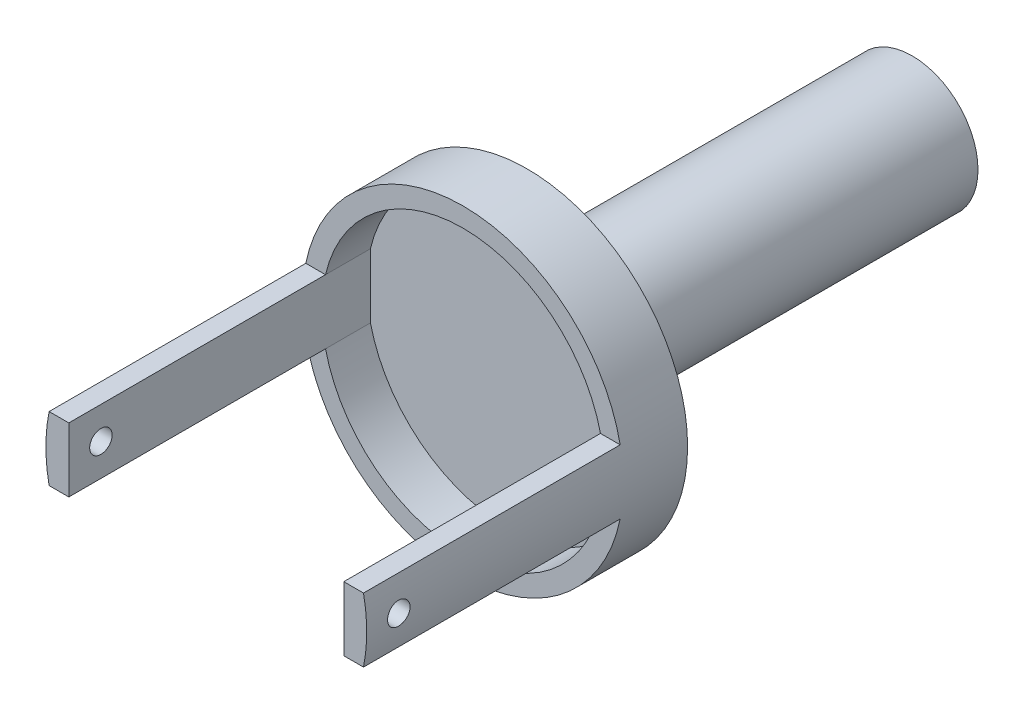
ISO-10303-21;
HEADER;
FILE_DESCRIPTION(('STEP AP214'),'2;1');
FILE_NAME('part.step','',(''),(''),'','','');
FILE_SCHEMA(('AUTOMOTIVE_DESIGN { 1 0 10303 214 1 1 1 1 }'));
ENDSEC;
DATA;
#1=APPLICATION_CONTEXT('core data for automotive mechanical design processes');
#2=APPLICATION_PROTOCOL_DEFINITION('international standard','automotive_design',2000,#1);
#3=PRODUCT_CONTEXT('',#1,'mechanical');
#4=PRODUCT('Part','Part','',(#3));
#5=PRODUCT_RELATED_PRODUCT_CATEGORY('part','',(#4));
#6=PRODUCT_DEFINITION_FORMATION('','',#4);
#7=PRODUCT_DEFINITION_CONTEXT('part definition',#1,'design');
#8=PRODUCT_DEFINITION('design','',#6,#7);
#9=PRODUCT_DEFINITION_SHAPE('','',#8);
#10=(LENGTH_UNIT() NAMED_UNIT(*) SI_UNIT(.MILLI.,.METRE.));
#11=(NAMED_UNIT(*) PLANE_ANGLE_UNIT() SI_UNIT($,.RADIAN.));
#12=(NAMED_UNIT(*) SI_UNIT($,.STERADIAN.) SOLID_ANGLE_UNIT());
#13=UNCERTAINTY_MEASURE_WITH_UNIT(LENGTH_MEASURE(1.E-05),#10,'distance_accuracy_value','');
#14=(GEOMETRIC_REPRESENTATION_CONTEXT(3) GLOBAL_UNCERTAINTY_ASSIGNED_CONTEXT((#13)) GLOBAL_UNIT_ASSIGNED_CONTEXT((#10,
#11,#12)) REPRESENTATION_CONTEXT('',''));
#15=CARTESIAN_POINT('',(0.,0.,0.));
#16=DIRECTION('',(0.,0.,1.));
#17=DIRECTION('',(1.,0.,0.));
#18=AXIS2_PLACEMENT_3D('',#15,#16,#17);
#19=CARTESIAN_POINT('',(0.,0.,10.));
#20=DIRECTION('',(0.,0.,1.));
#21=DIRECTION('',(1.,0.,0.));
#22=AXIS2_PLACEMENT_3D('',#19,#20,#21);
#23=PLANE('',#22);
#24=CARTESIAN_POINT('',(0.,0.,10.));
#25=DIRECTION('',(0.,0.,1.));
#26=DIRECTION('',(1.,0.,0.));
#27=AXIS2_PLACEMENT_3D('',#24,#25,#26);
#28=CIRCLE('',#27,25.);
#29=CARTESIAN_POINT('',(-24.4948974278318,-5.0000000000001,10.));
#30=VERTEX_POINT('',#29);
#31=CARTESIAN_POINT('',(24.4948974278318,-5.0000000000001,10.));
#32=VERTEX_POINT('',#31);
#33=EDGE_CURVE('E197',#30,#32,#28,.T.);
#34=ORIENTED_EDGE('',*,*,#33,.T.);
#35=DIRECTION('',(1.,0.,0.));
#36=VECTOR('',#35,1.);
#37=CARTESIAN_POINT('',(0.,-5.0000000000001,10.));
#38=LINE('',#37,#36);
#39=CARTESIAN_POINT('',(21.4242852856285,-5.0000000000001,10.));
#40=VERTEX_POINT('',#39);
#41=EDGE_CURVE('E141',#40,#32,#38,.T.);
#42=ORIENTED_EDGE('',*,*,#41,.F.);
#43=CARTESIAN_POINT('',(0.,0.,10.));
#44=DIRECTION('',(0.,0.,1.));
#45=DIRECTION('',(1.,0.,0.));
#46=AXIS2_PLACEMENT_3D('',#43,#44,#45);
#47=CIRCLE('',#46,22.);
#48=CARTESIAN_POINT('',(-21.4242852856285,-5.0000000000001,10.));
#49=VERTEX_POINT('',#48);
#50=EDGE_CURVE('E194',#49,#40,#47,.T.);
#51=ORIENTED_EDGE('',*,*,#50,.F.);
#52=DIRECTION('',(1.,0.,0.));
#53=VECTOR('',#52,1.);
#54=CARTESIAN_POINT('',(0.,-5.0000000000001,10.));
#55=LINE('',#54,#53);
#56=EDGE_CURVE('E50',#30,#49,#55,.T.);
#57=ORIENTED_EDGE('',*,*,#56,.F.);
#58=EDGE_LOOP('',(#34,#42,#51,#57));
#59=FACE_BOUND('',#58,.T.);
#60=ADVANCED_FACE('F35',(#59),#23,.T.);
#61=DIRECTION('',(1.,0.,0.));
#62=VECTOR('',#61,1.);
#63=CARTESIAN_POINT('',(0.,4.9999999999999,10.));
#64=LINE('',#63,#62);
#65=CARTESIAN_POINT('',(21.4242852856286,4.9999999999999,10.));
#66=VERTEX_POINT('',#65);
#67=CARTESIAN_POINT('',(24.4948974278318,4.9999999999999,10.));
#68=VERTEX_POINT('',#67);
#69=EDGE_CURVE('E139',#66,#68,#64,.T.);
#70=ORIENTED_EDGE('',*,*,#69,.T.);
#71=CARTESIAN_POINT('',(-24.4948974278318,4.9999999999999,10.));
#72=VERTEX_POINT('',#71);
#73=EDGE_CURVE('E58',#68,#72,#28,.T.);
#74=ORIENTED_EDGE('',*,*,#73,.T.);
#75=DIRECTION('',(1.,0.,0.));
#76=VECTOR('',#75,1.);
#77=CARTESIAN_POINT('',(0.,4.9999999999999,10.));
#78=LINE('',#77,#76);
#79=CARTESIAN_POINT('',(-21.4242852856286,4.9999999999999,10.));
#80=VERTEX_POINT('',#79);
#81=EDGE_CURVE('E159',#72,#80,#78,.T.);
#82=ORIENTED_EDGE('',*,*,#81,.T.);
#83=EDGE_CURVE('E193',#66,#80,#47,.T.);
#84=ORIENTED_EDGE('',*,*,#83,.F.);
#85=EDGE_LOOP('',(#70,#74,#82,#84));
#86=FACE_BOUND('',#85,.T.);
#87=ADVANCED_FACE('F231',(#86),#23,.T.);
#88=CARTESIAN_POINT('',(0.,0.,10.));
#89=DIRECTION('',(0.,0.,-1.));
#90=DIRECTION('',(-1.,0.,0.));
#91=AXIS2_PLACEMENT_3D('',#88,#89,#90);
#92=CYLINDRICAL_SURFACE('',#91,22.);
#93=ORIENTED_EDGE('',*,*,#50,.T.);
#94=DIRECTION('',(0.,0.,1.));
#95=VECTOR('',#94,1.);
#96=CARTESIAN_POINT('',(21.4242852856285,-5.0000000000001,-7.01655866215258));
#97=LINE('',#96,#95);
#98=CARTESIAN_POINT('',(21.4242852856285,-5.0000000000001,3.));
#99=VERTEX_POINT('',#98);
#100=EDGE_CURVE('E122',#99,#40,#97,.T.);
#101=ORIENTED_EDGE('',*,*,#100,.F.);
#102=CARTESIAN_POINT('',(0.,0.,3.));
#103=DIRECTION('',(0.,0.,1.));
#104=DIRECTION('',(1.,0.,0.));
#105=AXIS2_PLACEMENT_3D('',#102,#103,#104);
#106=CIRCLE('',#105,22.);
#107=CARTESIAN_POINT('',(-21.4242852856285,-5.00000000000012,3.));
#108=VERTEX_POINT('',#107);
#109=EDGE_CURVE('E202',#108,#99,#106,.T.);
#110=ORIENTED_EDGE('',*,*,#109,.F.);
#111=DIRECTION('',(0.,0.,1.));
#112=VECTOR('',#111,1.);
#113=CARTESIAN_POINT('',(-21.4242852856285,-5.0000000000001,-7.01655866215258));
#114=LINE('',#113,#112);
#115=EDGE_CURVE('E181',#108,#49,#114,.T.);
#116=ORIENTED_EDGE('',*,*,#115,.T.);
#117=EDGE_LOOP('',(#93,#101,#110,#116));
#118=FACE_BOUND('',#117,.T.);
#119=ADVANCED_FACE('F236',(#118),#92,.F.);
#120=CARTESIAN_POINT('',(21.4242852856286,4.99999999999991,3.));
#121=VERTEX_POINT('',#120);
#122=CARTESIAN_POINT('',(-21.4242852856286,4.9999999999999,3.));
#123=VERTEX_POINT('',#122);
#124=EDGE_CURVE('E199',#121,#123,#106,.T.);
#125=ORIENTED_EDGE('',*,*,#124,.F.);
#126=DIRECTION('',(0.,0.,1.));
#127=VECTOR('',#126,1.);
#128=CARTESIAN_POINT('',(21.4242852856286,4.9999999999999,-7.01655866215258));
#129=LINE('',#128,#127);
#130=EDGE_CURVE('E182',#121,#66,#129,.T.);
#131=ORIENTED_EDGE('',*,*,#130,.T.);
#132=ORIENTED_EDGE('',*,*,#83,.T.);
#133=DIRECTION('',(0.,0.,1.));
#134=VECTOR('',#133,1.);
#135=CARTESIAN_POINT('',(-21.4242852856286,4.9999999999999,-7.01655866215258));
#136=LINE('',#135,#134);
#137=EDGE_CURVE('E186',#123,#80,#136,.T.);
#138=ORIENTED_EDGE('',*,*,#137,.F.);
#139=EDGE_LOOP('',(#125,#131,#132,#138));
#140=FACE_BOUND('',#139,.T.);
#141=ADVANCED_FACE('F240',(#140),#92,.F.);
#142=CARTESIAN_POINT('',(0.,0.,3.));
#143=DIRECTION('',(0.,0.,1.));
#144=DIRECTION('',(1.,0.,0.));
#145=AXIS2_PLACEMENT_3D('',#142,#143,#144);
#146=PLANE('',#145);
#147=ORIENTED_EDGE('',*,*,#109,.T.);
#148=DIRECTION('',(0.,-1.,0.));
#149=VECTOR('',#148,1.);
#150=CARTESIAN_POINT('',(21.4242852856285,-1.04062589794812E-13,3.));
#151=LINE('',#150,#149);
#152=EDGE_CURVE('E179',#121,#99,#151,.T.);
#153=ORIENTED_EDGE('',*,*,#152,.F.);
#154=ORIENTED_EDGE('',*,*,#124,.T.);
#155=DIRECTION('',(0.,-1.,0.));
#156=VECTOR('',#155,1.);
#157=CARTESIAN_POINT('',(-21.4242852856285,-1.04062589794812E-13,3.));
#158=LINE('',#157,#156);
#159=EDGE_CURVE('E189',#123,#108,#158,.T.);
#160=ORIENTED_EDGE('',*,*,#159,.T.);
#161=EDGE_LOOP('',(#147,#153,#154,#160));
#162=FACE_BOUND('',#161,.T.);
#163=ADVANCED_FACE('F216',(#162),#146,.T.);
#164=CARTESIAN_POINT('',(0.,0.,0.));
#165=DIRECTION('',(0.,0.,1.));
#166=DIRECTION('',(1.,0.,0.));
#167=AXIS2_PLACEMENT_3D('',#164,#165,#166);
#168=PLANE('',#167);
#169=CARTESIAN_POINT('',(0.,0.,0.));
#170=DIRECTION('',(0.,0.,1.));
#171=DIRECTION('',(1.,0.,0.));
#172=AXIS2_PLACEMENT_3D('',#169,#170,#171);
#173=CIRCLE('',#172,10.25);
#174=CARTESIAN_POINT('',(10.25,0.,0.));
#175=VERTEX_POINT('',#174);
#176=EDGE_CURVE('E43',#175,#175,#173,.F.);
#177=ORIENTED_EDGE('',*,*,#176,.F.);
#178=EDGE_LOOP('',(#177));
#179=FACE_BOUND('',#178,.T.);
#180=CARTESIAN_POINT('',(0.,0.,0.));
#181=DIRECTION('',(0.,0.,1.));
#182=DIRECTION('',(1.,0.,0.));
#183=AXIS2_PLACEMENT_3D('',#180,#181,#182);
#184=CIRCLE('',#183,25.);
#185=CARTESIAN_POINT('',(25.,0.,0.));
#186=VERTEX_POINT('',#185);
#187=EDGE_CURVE('E196',#186,#186,#184,.T.);
#188=ORIENTED_EDGE('',*,*,#187,.F.);
#189=EDGE_LOOP('',(#188));
#190=FACE_BOUND('',#189,.T.);
#191=ADVANCED_FACE('F213',(#179,#190),#168,.F.);
#192=CARTESIAN_POINT('',(0.,0.,10.));
#193=DIRECTION('',(0.,0.,-1.));
#194=DIRECTION('',(-1.,0.,0.));
#195=AXIS2_PLACEMENT_3D('',#192,#193,#194);
#196=CYLINDRICAL_SURFACE('',#195,25.);
#197=CARTESIAN_POINT('',(-24.9386747843585,1.74999999999988,45.));
#198=CARTESIAN_POINT('',(-24.9386756022482,1.74999569008594,44.9018310164451));
#199=CARTESIAN_POINT('',(-24.9392606709468,1.74171181722103,44.8035939177404));
#200=CARTESIAN_POINT('',(-24.9415379065442,1.70878573245791,44.6098340951323));
#201=CARTESIAN_POINT('',(-24.9432313508469,1.6841246453262,44.514314636015));
#202=CARTESIAN_POINT('',(-24.9475325908212,1.61915755926675,44.3288246619012));
#203=CARTESIAN_POINT('',(-24.9501398920928,1.5788600184606,44.2388511773978));
#204=CARTESIAN_POINT('',(-24.9559744420764,1.48377807164931,44.0669682157291));
#205=CARTESIAN_POINT('',(-24.9592015518755,1.42899691071221,43.9850569378536));
#206=CARTESIAN_POINT('',(-24.9659188372089,1.30639229539667,43.8314490925891));
#207=CARTESIAN_POINT('',(-24.9694094345976,1.23854764452305,43.75976946053));
#208=CARTESIAN_POINT('',(-24.9762564882174,1.09178613725417,43.6288047860661));
#209=CARTESIAN_POINT('',(-24.9796129387628,1.01286881218906,43.5695202685704));
#210=CARTESIAN_POINT('',(-24.9858172954192,0.846104425567847,43.464974966525));
#211=CARTESIAN_POINT('',(-24.9886646832294,0.758248404258808,43.4197284406476));
#212=CARTESIAN_POINT('',(-24.9935256001883,0.576163254251224,43.3446347556245));
#213=CARTESIAN_POINT('',(-24.9955391401137,0.481934207937026,43.3147873974561));
#214=CARTESIAN_POINT('',(-24.998502559418,0.289943105425339,43.2713869714236));
#215=CARTESIAN_POINT('',(-24.9994541925318,0.192187150423745,43.2578070352421));
#216=CARTESIAN_POINT('',(-25.0001924934275,-0.00422098503061473,43.2472439349903));
#217=CARTESIAN_POINT('',(-24.9999791771357,-0.102873153212575,43.2502605440237));
#218=CARTESIAN_POINT('',(-24.9984130723396,-0.298091291577646,43.2727828064203));
#219=CARTESIAN_POINT('',(-24.9970622808482,-0.394660613970764,43.2922595616772));
#220=CARTESIAN_POINT('',(-24.993375552753,-0.583155936353323,43.347104368482));
#221=CARTESIAN_POINT('',(-24.9910396091484,-0.675081903340187,43.3824725329602));
#222=CARTESIAN_POINT('',(-24.9856420769225,-0.851773581340144,43.4681287408558));
#223=CARTESIAN_POINT('',(-24.9825798542809,-0.936532947926279,43.5184298299925));
#224=CARTESIAN_POINT('',(-24.9760742306574,-1.09641614792925,43.632514541616));
#225=CARTESIAN_POINT('',(-24.972630824259,-1.17153984439252,43.6962983557011));
#226=CARTESIAN_POINT('',(-24.9657414666507,-1.31018798232081,43.8357010288765));
#227=CARTESIAN_POINT('',(-24.9622955258241,-1.37368719887966,43.91134497956));
#228=CARTESIAN_POINT('',(-24.9557969668471,-1.48708925210412,44.0722329174322));
#229=CARTESIAN_POINT('',(-24.9527443488997,-1.53699208175227,44.1574769095757));
#230=CARTESIAN_POINT('',(-24.947377276302,-1.62178328086682,44.3351617506855));
#231=CARTESIAN_POINT('',(-24.9450628778525,-1.65667050726485,44.4276031469246));
#232=CARTESIAN_POINT('',(-24.9414351519985,-1.71042235338658,44.6170510163432));
#233=CARTESIAN_POINT('',(-24.9401218097998,-1.72928720989956,44.7140574220355));
#234=CARTESIAN_POINT('',(-24.9386470951713,-1.75042722018861,44.9096613955438));
#235=CARTESIAN_POINT('',(-24.9384832853997,-1.75273747473591,45.0082551522442));
#236=CARTESIAN_POINT('',(-24.9393197379472,-1.74079448883181,45.2044286965402));
#237=CARTESIAN_POINT('',(-24.9403199926437,-1.72654135684147,45.3020084907713));
#238=CARTESIAN_POINT('',(-24.9433696346062,-1.68190538378981,45.4932844273246));
#239=CARTESIAN_POINT('',(-24.9454179657484,-1.65153877878467,45.5869843767382));
#240=CARTESIAN_POINT('',(-24.9503320550969,-1.57555432019901,45.7679584746397));
#241=CARTESIAN_POINT('',(-24.9531978225956,-1.52993629324258,45.8552325500655));
#242=CARTESIAN_POINT('',(-24.959429769714,-1.4246545081811,46.0210385453152));
#243=CARTESIAN_POINT('',(-24.9627967822635,-1.36496727278085,46.0995555259994));
#244=CARTESIAN_POINT('',(-24.9696489292536,-1.23327545520598,46.2454678697198));
#245=CARTESIAN_POINT('',(-24.9731340651356,-1.16127072267432,46.3128630969755));
#246=CARTESIAN_POINT('',(-24.979836924206,-1.00683658930638,46.4347378042383));
#247=CARTESIAN_POINT('',(-24.9830541701283,-0.924389216007458,46.4891945401768));
#248=CARTESIAN_POINT('',(-24.9888518811501,-0.751500280833662,46.5834906689492));
#249=CARTESIAN_POINT('',(-24.9914323509832,-0.661058778392055,46.6233301704452));
#250=CARTESIAN_POINT('',(-24.9956635098085,-0.474831807980913,46.6872215334199));
#251=CARTESIAN_POINT('',(-24.997315039963,-0.379051261234714,46.7112876810719));
#252=CARTESIAN_POINT('',(-24.9995056109322,-0.184796947719894,46.7429959200916));
#253=CARTESIAN_POINT('',(-25.0000446659958,-0.0863232154626317,46.7506382218201));
#254=CARTESIAN_POINT('',(-24.9999495868217,0.110297365497591,46.7492796748724));
#255=CARTESIAN_POINT('',(-24.9993179581001,0.208444462973854,46.7403143700803));
#256=CARTESIAN_POINT('',(-24.9969574823398,0.401835869399694,46.7060689394078));
#257=CARTESIAN_POINT('',(-24.9952286334946,0.497080173569829,46.6807887866667));
#258=CARTESIAN_POINT('',(-24.9908679199989,0.681966621306582,46.6146396612723));
#259=CARTESIAN_POINT('',(-24.9882360741541,0.771608881494301,46.57377101326));
#260=CARTESIAN_POINT('',(-24.9823645160654,0.942764665081319,46.4776095501575));
#261=CARTESIAN_POINT('',(-24.979124817562,1.02427837216157,46.422317061105));
#262=CARTESIAN_POINT('',(-24.9723934653178,1.17704425379665,46.29874499944));
#263=CARTESIAN_POINT('',(-24.9689013163173,1.24827538831625,46.2304394436854));
#264=CARTESIAN_POINT('',(-24.9620627460513,1.37828658686123,46.0828206347337));
#265=CARTESIAN_POINT('',(-24.9587163605308,1.43706361032437,46.0035047012543));
#266=CARTESIAN_POINT('',(-24.9525428708672,1.54055321656308,45.836005577068));
#267=CARTESIAN_POINT('',(-24.949716523776,1.58524536148506,45.7478097436375));
#268=CARTESIAN_POINT('',(-24.9449126309857,1.65913155221389,45.5652090983348));
#269=CARTESIAN_POINT('',(-24.9429340976275,1.68834364092753,45.4708116597424));
#270=CARTESIAN_POINT('',(-24.940565223777,1.72289768793572,45.3132027221545));
#271=CARTESIAN_POINT('',(-24.9398595064314,1.73304779308939,45.2510084259061));
#272=CARTESIAN_POINT('',(-24.9389140248798,1.74660032506356,45.1258854236498));
#273=CARTESIAN_POINT('',(-24.938674259838,1.75000276398939,45.0629567189596));
#274=CARTESIAN_POINT('',(-24.9386747843585,1.74999999999988,45.));
#275=B_SPLINE_CURVE_WITH_KNOTS('',3,(#197,#198,#199,#200,#201,#202,#203,#204,#205,#206,#207,
#208,#209,#210,#211,#212,#213,#214,#215,#216,#217,#218,#219,#220,#221,#222,#223,#224,#225,#226,
#227,#228,#229,#230,#231,#232,#233,#234,#235,#236,#237,#238,#239,#240,#241,#242,#243,#244,#245,
#246,#247,#248,#249,#250,#251,#252,#253,#254,#255,#256,#257,#258,#259,#260,#261,#262,#263,#264,
#265,#266,#267,#268,#269,#270,#271,#272,#273,#274),.UNSPECIFIED.,.T.,.F.,(4,2,2,2,2,2,2,2,2,2,2,
2,2,2,2,2,2,2,2,2,2,2,2,2,2,2,2,2,2,2,2,2,2,2,2,2,2,2,4),(0.,0.294277108136918,
0.588893969504724,0.883351687421533,1.17774348764921,1.47261704845816,1.76750309406157,
2.06268768815941,2.35786846712337,2.65256103138686,2.94724956683032,3.24142180722538,
3.53559613815097,3.83002822609902,4.12446449840098,4.4195323083064,4.71460027050376,
5.00969069088829,5.30477675015368,5.59923695194234,5.89369522554528,6.18785736261384,
6.4820228437878,6.7766827181821,7.07134618968259,7.3665238684237,7.66169935281713,
7.9566071213531,8.25151111261362,8.54578467438708,8.84005872065513,9.13432663880224,
9.42858790586819,9.72344300085019,10.0183699993902,10.3137230018716,10.6087309918097,
10.7974540870221,10.986176843664),.UNSPECIFIED.);
#276=CARTESIAN_POINT('',(-24.9386747843585,1.74999999999988,45.));
#277=VERTEX_POINT('',#276);
#278=EDGE_CURVE('E207',#277,#277,#275,.T.);
#279=ORIENTED_EDGE('',*,*,#278,.F.);
#280=EDGE_LOOP('',(#279));
#281=FACE_BOUND('',#280,.T.);
#282=CARTESIAN_POINT('',(24.9386747843585,-1.74999999999988,45.));
#283=CARTESIAN_POINT('',(24.9386756022482,-1.74999569008594,45.0981689835549));
#284=CARTESIAN_POINT('',(24.9392606709468,-1.74171181722103,45.1964060822596));
#285=CARTESIAN_POINT('',(24.9415379065442,-1.70878573245791,45.3901659048677));
#286=CARTESIAN_POINT('',(24.9432313508469,-1.6841246453262,45.485685363985));
#287=CARTESIAN_POINT('',(24.9475325908212,-1.61915755926675,45.6711753380988));
#288=CARTESIAN_POINT('',(24.9501398920928,-1.5788600184606,45.7611488226022));
#289=CARTESIAN_POINT('',(24.9559744420764,-1.48377807164931,45.9330317842709));
#290=CARTESIAN_POINT('',(24.9592015518755,-1.42899691071221,46.0149430621464));
#291=CARTESIAN_POINT('',(24.9659188372089,-1.30639229539667,46.1685509074109));
#292=CARTESIAN_POINT('',(24.9694094345976,-1.23854764452305,46.24023053947));
#293=CARTESIAN_POINT('',(24.9762564882174,-1.09178613725417,46.3711952139339));
#294=CARTESIAN_POINT('',(24.9796129387628,-1.01286881218906,46.4304797314296));
#295=CARTESIAN_POINT('',(24.9858172954192,-0.846104425567845,46.5350250334751));
#296=CARTESIAN_POINT('',(24.9886646832294,-0.758248404258803,46.5802715593525));
#297=CARTESIAN_POINT('',(24.9935256001883,-0.576163254251219,46.6553652443756));
#298=CARTESIAN_POINT('',(24.9955391401137,-0.481934207937024,46.6852126025439));
#299=CARTESIAN_POINT('',(24.998502559418,-0.289943105425338,46.7286130285765));
#300=CARTESIAN_POINT('',(24.9994541925318,-0.192187150423745,46.7421929647579));
#301=CARTESIAN_POINT('',(25.0001924934275,0.00422098503061515,46.7527560650097));
#302=CARTESIAN_POINT('',(24.9999791771357,0.102873153212575,46.7497394559763));
#303=CARTESIAN_POINT('',(24.9984130723396,0.298091291577645,46.7272171935798));
#304=CARTESIAN_POINT('',(24.9970622808482,0.394660613970761,46.7077404383229));
#305=CARTESIAN_POINT('',(24.993375552753,0.58315593635332,46.652895631518));
#306=CARTESIAN_POINT('',(24.9910396091484,0.675081903340186,46.6175274670398));
#307=CARTESIAN_POINT('',(24.9856420769225,0.851773581340144,46.5318712591442));
#308=CARTESIAN_POINT('',(24.9825798542809,0.936532947926279,46.4815701700075));
#309=CARTESIAN_POINT('',(24.9760742306574,1.09641614792925,46.367485458384));
#310=CARTESIAN_POINT('',(24.972630824259,1.17153984439252,46.3037016442989));
#311=CARTESIAN_POINT('',(24.9657414666507,1.31018798232081,46.1642989711235));
#312=CARTESIAN_POINT('',(24.9622955258241,1.37368719887966,46.08865502044));
#313=CARTESIAN_POINT('',(24.9557969668471,1.48708925210412,45.9277670825678));
#314=CARTESIAN_POINT('',(24.9527443488997,1.53699208175227,45.8425230904243));
#315=CARTESIAN_POINT('',(24.947377276302,1.62178328086682,45.6648382493145));
#316=CARTESIAN_POINT('',(24.9450628778525,1.65667050726485,45.5723968530754));
#317=CARTESIAN_POINT('',(24.9414351519985,1.71042235338658,45.3829489836568));
#318=CARTESIAN_POINT('',(24.9401218097998,1.72928720989956,45.2859425779645));
#319=CARTESIAN_POINT('',(24.9386470951713,1.75042722018861,45.0903386044562));
#320=CARTESIAN_POINT('',(24.9384832853997,1.75273747473591,44.9917448477558));
#321=CARTESIAN_POINT('',(24.9393197379472,1.74079448883181,44.7955713034598));
#322=CARTESIAN_POINT('',(24.9403199926437,1.72654135684147,44.6979915092287));
#323=CARTESIAN_POINT('',(24.9433696346062,1.68190538378981,44.5067155726754));
#324=CARTESIAN_POINT('',(24.9454179657484,1.65153877878467,44.4130156232618));
#325=CARTESIAN_POINT('',(24.9503320550969,1.57555432019901,44.2320415253603));
#326=CARTESIAN_POINT('',(24.9531978225956,1.52993629324258,44.1447674499345));
#327=CARTESIAN_POINT('',(24.959429769714,1.4246545081811,43.9789614546848));
#328=CARTESIAN_POINT('',(24.9627967822635,1.36496727278085,43.9004444740006));
#329=CARTESIAN_POINT('',(24.9696489292536,1.23327545520597,43.7545321302802));
#330=CARTESIAN_POINT('',(24.9731340651356,1.16127072267432,43.6871369030245));
#331=CARTESIAN_POINT('',(24.979836924206,1.00683658930638,43.5652621957617));
#332=CARTESIAN_POINT('',(24.9830541701283,0.924389216007458,43.5108054598232));
#333=CARTESIAN_POINT('',(24.9888518811501,0.751500280833662,43.4165093310508));
#334=CARTESIAN_POINT('',(24.9914323509832,0.661058778392056,43.3766698295548));
#335=CARTESIAN_POINT('',(24.9956635098085,0.474831807980911,43.3127784665801));
#336=CARTESIAN_POINT('',(24.997315039963,0.379051261234711,43.2887123189281));
#337=CARTESIAN_POINT('',(24.9995056109322,0.184796947719891,43.2570040799084));
#338=CARTESIAN_POINT('',(25.0000446659958,0.0863232154626302,43.2493617781799));
#339=CARTESIAN_POINT('',(24.9999495868217,-0.110297365497591,43.2507203251276));
#340=CARTESIAN_POINT('',(24.9993179581001,-0.208444462973853,43.2596856299197));
#341=CARTESIAN_POINT('',(24.9969574823398,-0.401835869399693,43.2939310605922));
#342=CARTESIAN_POINT('',(24.9952286334946,-0.497080173569828,43.3192112133333));
#343=CARTESIAN_POINT('',(24.9908679199989,-0.681966621306582,43.3853603387277));
#344=CARTESIAN_POINT('',(24.9882360741541,-0.771608881494301,43.42622898674));
#345=CARTESIAN_POINT('',(24.9823645160654,-0.94276466508132,43.5223904498425));
#346=CARTESIAN_POINT('',(24.979124817562,-1.02427837216157,43.577682938895));
#347=CARTESIAN_POINT('',(24.9723934653178,-1.17704425379665,43.70125500056));
#348=CARTESIAN_POINT('',(24.9689013163173,-1.24827538831625,43.7695605563146));
#349=CARTESIAN_POINT('',(24.9620627460513,-1.37828658686123,43.9171793652663));
#350=CARTESIAN_POINT('',(24.9587163605308,-1.43706361032437,43.9964952987457));
#351=CARTESIAN_POINT('',(24.9525428708672,-1.54055321656308,44.1639944229321));
#352=CARTESIAN_POINT('',(24.949716523776,-1.58524536148506,44.2521902563626));
#353=CARTESIAN_POINT('',(24.9449126309857,-1.65913155221389,44.4347909016652));
#354=CARTESIAN_POINT('',(24.9429340976275,-1.68834364092753,44.5291883402576));
#355=CARTESIAN_POINT('',(24.940565223777,-1.72289768793572,44.6867972778455));
#356=CARTESIAN_POINT('',(24.9398595064314,-1.73304779308939,44.7489915740939));
#357=CARTESIAN_POINT('',(24.9389140248798,-1.74660032506356,44.8741145763502));
#358=CARTESIAN_POINT('',(24.938674259838,-1.75000276398939,44.9370432810404));
#359=CARTESIAN_POINT('',(24.9386747843585,-1.74999999999988,45.));
#360=B_SPLINE_CURVE_WITH_KNOTS('',3,(#282,#283,#284,#285,#286,#287,#288,#289,#290,#291,#292,
#293,#294,#295,#296,#297,#298,#299,#300,#301,#302,#303,#304,#305,#306,#307,#308,#309,#310,#311,
#312,#313,#314,#315,#316,#317,#318,#319,#320,#321,#322,#323,#324,#325,#326,#327,#328,#329,#330,
#331,#332,#333,#334,#335,#336,#337,#338,#339,#340,#341,#342,#343,#344,#345,#346,#347,#348,#349,
#350,#351,#352,#353,#354,#355,#356,#357,#358,#359),.UNSPECIFIED.,.T.,.F.,(4,2,2,2,2,2,2,2,2,2,2,
2,2,2,2,2,2,2,2,2,2,2,2,2,2,2,2,2,2,2,2,2,2,2,2,2,2,2,4),(0.,0.294277108136918,
0.588893969504724,0.883351687421533,1.17774348764921,1.47261704845816,1.76750309406157,
2.06268768815942,2.35786846712337,2.65256103138686,2.94724956683032,3.24142180722537,
3.53559613815097,3.83002822609902,4.12446449840098,4.4195323083064,4.71460027050376,
5.00969069088828,5.30477675015368,5.59923695194233,5.89369522554528,6.18785736261384,
6.4820228437878,6.77668271818211,7.07134618968259,7.36652386842369,7.66169935281713,
7.9566071213531,8.25151111261362,8.54578467438708,8.84005872065513,9.13432663880224,
9.42858790586819,9.7234430008502,10.0183699993902,10.3137230018716,10.6087309918096,
10.7974540870221,10.9861768436639),.UNSPECIFIED.);
#361=CARTESIAN_POINT('',(24.9386747843585,-1.74999999999988,45.));
#362=VERTEX_POINT('',#361);
#363=EDGE_CURVE('E279',#362,#362,#360,.T.);
#364=ORIENTED_EDGE('',*,*,#363,.T.);
#365=EDGE_LOOP('',(#364));
#366=FACE_BOUND('',#365,.T.);
#367=ORIENTED_EDGE('',*,*,#33,.F.);
#368=DIRECTION('',(0.,0.,-1.));
#369=VECTOR('',#368,1.);
#370=CARTESIAN_POINT('',(-24.4948974278318,-5.0000000000001,50.));
#371=LINE('',#370,#369);
#372=CARTESIAN_POINT('',(-24.4948974278318,-5.0000000000001,50.));
#373=VERTEX_POINT('',#372);
#374=EDGE_CURVE('E176',#373,#30,#371,.T.);
#375=ORIENTED_EDGE('',*,*,#374,.F.);
#376=CARTESIAN_POINT('',(0.,0.,50.));
#377=DIRECTION('',(0.,0.,1.));
#378=DIRECTION('',(1.,0.,0.));
#379=AXIS2_PLACEMENT_3D('',#376,#377,#378);
#380=CIRCLE('',#379,25.);
#381=CARTESIAN_POINT('',(-24.4948974278318,4.9999999999999,50.));
#382=VERTEX_POINT('',#381);
#383=EDGE_CURVE('E155',#382,#373,#380,.T.);
#384=ORIENTED_EDGE('',*,*,#383,.F.);
#385=DIRECTION('',(0.,0.,-1.));
#386=VECTOR('',#385,1.);
#387=CARTESIAN_POINT('',(-24.4948974278318,4.9999999999999,50.));
#388=LINE('',#387,#386);
#389=EDGE_CURVE('E166',#382,#72,#388,.T.);
#390=ORIENTED_EDGE('',*,*,#389,.T.);
#391=ORIENTED_EDGE('',*,*,#73,.F.);
#392=DIRECTION('',(0.,0.,-1.));
#393=VECTOR('',#392,1.);
#394=CARTESIAN_POINT('',(24.4948974278318,4.9999999999999,50.));
#395=LINE('',#394,#393);
#396=CARTESIAN_POINT('',(24.4948974278318,4.9999999999999,50.));
#397=VERTEX_POINT('',#396);
#398=EDGE_CURVE('E152',#397,#68,#395,.T.);
#399=ORIENTED_EDGE('',*,*,#398,.F.);
#400=CARTESIAN_POINT('',(0.,0.,50.));
#401=DIRECTION('',(0.,0.,1.));
#402=DIRECTION('',(1.,0.,0.));
#403=AXIS2_PLACEMENT_3D('',#400,#401,#402);
#404=CIRCLE('',#403,25.);
#405=CARTESIAN_POINT('',(24.4948974278318,-5.0000000000001,50.));
#406=VERTEX_POINT('',#405);
#407=EDGE_CURVE('E134',#406,#397,#404,.T.);
#408=ORIENTED_EDGE('',*,*,#407,.F.);
#409=DIRECTION('',(0.,0.,-1.));
#410=VECTOR('',#409,1.);
#411=CARTESIAN_POINT('',(24.4948974278318,-5.0000000000001,50.));
#412=LINE('',#411,#410);
#413=EDGE_CURVE('E126',#406,#32,#412,.T.);
#414=ORIENTED_EDGE('',*,*,#413,.T.);
#415=EDGE_LOOP('',(#367,#375,#384,#390,#391,#399,#408,#414));
#416=FACE_BOUND('',#415,.T.);
#417=ORIENTED_EDGE('',*,*,#187,.T.);
#418=EDGE_LOOP('',(#417));
#419=FACE_BOUND('',#418,.T.);
#420=ADVANCED_FACE('F37',(#281,#366,#416,#419),#196,.T.);
#421=CARTESIAN_POINT('',(-21.4242852856285,-1.04062589794812E-13,-7.01655866215258));
#422=DIRECTION('',(1.,0.,0.));
#423=DIRECTION('',(0.,1.,0.));
#424=AXIS2_PLACEMENT_3D('',#421,#422,#423);
#425=PLANE('',#424);
#426=CARTESIAN_POINT('',(-21.4242852856285,-1.04062589794812E-13,45.));
#427=DIRECTION('',(1.,0.,0.));
#428=DIRECTION('',(0.,1.,0.));
#429=AXIS2_PLACEMENT_3D('',#426,#427,#428);
#430=CIRCLE('',#429,1.75);
#431=CARTESIAN_POINT('',(-21.4242852856286,1.7499999999999,45.));
#432=VERTEX_POINT('',#431);
#433=EDGE_CURVE('E144',#432,#432,#430,.T.);
#434=ORIENTED_EDGE('',*,*,#433,.F.);
#435=EDGE_LOOP('',(#434));
#436=FACE_BOUND('',#435,.T.);
#437=ORIENTED_EDGE('',*,*,#159,.F.);
#438=ORIENTED_EDGE('',*,*,#137,.T.);
#439=DIRECTION('',(0.,0.,-1.));
#440=VECTOR('',#439,1.);
#441=CARTESIAN_POINT('',(-21.4242852856286,4.9999999999999,50.));
#442=LINE('',#441,#440);
#443=CARTESIAN_POINT('',(-21.4242852856286,4.9999999999999,50.));
#444=VERTEX_POINT('',#443);
#445=EDGE_CURVE('E170',#444,#80,#442,.T.);
#446=ORIENTED_EDGE('',*,*,#445,.F.);
#447=DIRECTION('',(0.,1.,0.));
#448=VECTOR('',#447,1.);
#449=CARTESIAN_POINT('',(-21.4242852856285,-1.04062589794812E-13,50.));
#450=LINE('',#449,#448);
#451=CARTESIAN_POINT('',(-21.4242852856285,-5.0000000000001,50.));
#452=VERTEX_POINT('',#451);
#453=EDGE_CURVE('E161',#452,#444,#450,.T.);
#454=ORIENTED_EDGE('',*,*,#453,.F.);
#455=DIRECTION('',(0.,0.,-1.));
#456=VECTOR('',#455,1.);
#457=CARTESIAN_POINT('',(-21.4242852856285,-5.0000000000001,50.));
#458=LINE('',#457,#456);
#459=EDGE_CURVE('E173',#452,#49,#458,.T.);
#460=ORIENTED_EDGE('',*,*,#459,.T.);
#461=ORIENTED_EDGE('',*,*,#115,.F.);
#462=EDGE_LOOP('',(#437,#438,#446,#454,#460,#461));
#463=FACE_BOUND('',#462,.T.);
#464=ADVANCED_FACE('F220',(#436,#463),#425,.T.);
#465=CARTESIAN_POINT('',(21.4242852856285,-1.04062589794812E-13,-7.01655866215258));
#466=DIRECTION('',(1.,0.,0.));
#467=DIRECTION('',(0.,1.,0.));
#468=AXIS2_PLACEMENT_3D('',#465,#466,#467);
#469=PLANE('',#468);
#470=CARTESIAN_POINT('',(21.4242852856285,1.04062589794812E-13,45.));
#471=DIRECTION('',(1.,0.,0.));
#472=DIRECTION('',(0.,1.,0.));
#473=AXIS2_PLACEMENT_3D('',#470,#471,#472);
#474=CIRCLE('',#473,1.75);
#475=CARTESIAN_POINT('',(21.4242852856286,1.75000000000011,45.));
#476=VERTEX_POINT('',#475);
#477=EDGE_CURVE('E205',#476,#476,#474,.T.);
#478=ORIENTED_EDGE('',*,*,#477,.T.);
#479=EDGE_LOOP('',(#478));
#480=FACE_BOUND('',#479,.T.);
#481=ORIENTED_EDGE('',*,*,#130,.F.);
#482=ORIENTED_EDGE('',*,*,#152,.T.);
#483=ORIENTED_EDGE('',*,*,#100,.T.);
#484=DIRECTION('',(0.,0.,-1.));
#485=VECTOR('',#484,1.);
#486=CARTESIAN_POINT('',(21.4242852856285,-5.0000000000001,50.));
#487=LINE('',#486,#485);
#488=CARTESIAN_POINT('',(21.4242852856285,-5.0000000000001,50.));
#489=VERTEX_POINT('',#488);
#490=EDGE_CURVE('E114',#489,#40,#487,.T.);
#491=ORIENTED_EDGE('',*,*,#490,.F.);
#492=DIRECTION('',(0.,1.,0.));
#493=VECTOR('',#492,1.);
#494=CARTESIAN_POINT('',(21.4242852856285,-1.04062589794812E-13,50.));
#495=LINE('',#494,#493);
#496=CARTESIAN_POINT('',(21.4242852856286,4.9999999999999,50.));
#497=VERTEX_POINT('',#496);
#498=EDGE_CURVE('E119',#489,#497,#495,.T.);
#499=ORIENTED_EDGE('',*,*,#498,.T.);
#500=DIRECTION('',(0.,0.,-1.));
#501=VECTOR('',#500,1.);
#502=CARTESIAN_POINT('',(21.4242852856286,4.9999999999999,50.));
#503=LINE('',#502,#501);
#504=EDGE_CURVE('E149',#497,#66,#503,.T.);
#505=ORIENTED_EDGE('',*,*,#504,.T.);
#506=EDGE_LOOP('',(#481,#482,#483,#491,#499,#505));
#507=FACE_BOUND('',#506,.T.);
#508=ADVANCED_FACE('F116',(#480,#507),#469,.F.);
#509=CARTESIAN_POINT('',(0.,-5.0000000000001,50.));
#510=DIRECTION('',(0.,1.,0.));
#511=DIRECTION('',(0.,0.,1.));
#512=AXIS2_PLACEMENT_3D('',#509,#510,#511);
#513=PLANE('',#512);
#514=ORIENTED_EDGE('',*,*,#56,.T.);
#515=ORIENTED_EDGE('',*,*,#459,.F.);
#516=DIRECTION('',(1.,0.,0.));
#517=VECTOR('',#516,1.);
#518=CARTESIAN_POINT('',(0.,-5.0000000000001,50.));
#519=LINE('',#518,#517);
#520=EDGE_CURVE('E158',#373,#452,#519,.T.);
#521=ORIENTED_EDGE('',*,*,#520,.F.);
#522=ORIENTED_EDGE('',*,*,#374,.T.);
#523=EDGE_LOOP('',(#514,#515,#521,#522));
#524=FACE_BOUND('',#523,.T.);
#525=ADVANCED_FACE('F247',(#524),#513,.F.);
#526=CARTESIAN_POINT('',(0.,4.9999999999999,50.));
#527=DIRECTION('',(0.,1.,0.));
#528=DIRECTION('',(0.,0.,1.));
#529=AXIS2_PLACEMENT_3D('',#526,#527,#528);
#530=PLANE('',#529);
#531=ORIENTED_EDGE('',*,*,#81,.F.);
#532=ORIENTED_EDGE('',*,*,#389,.F.);
#533=DIRECTION('',(1.,0.,0.));
#534=VECTOR('',#533,1.);
#535=CARTESIAN_POINT('',(0.,4.9999999999999,50.));
#536=LINE('',#535,#534);
#537=EDGE_CURVE('E163',#382,#444,#536,.T.);
#538=ORIENTED_EDGE('',*,*,#537,.T.);
#539=ORIENTED_EDGE('',*,*,#445,.T.);
#540=EDGE_LOOP('',(#531,#532,#538,#539));
#541=FACE_BOUND('',#540,.T.);
#542=ADVANCED_FACE('F251',(#541),#530,.T.);
#543=CARTESIAN_POINT('',(0.,0.,50.));
#544=DIRECTION('',(0.,0.,1.));
#545=DIRECTION('',(1.,0.,0.));
#546=AXIS2_PLACEMENT_3D('',#543,#544,#545);
#547=PLANE('',#546);
#548=ORIENTED_EDGE('',*,*,#383,.T.);
#549=ORIENTED_EDGE('',*,*,#520,.T.);
#550=ORIENTED_EDGE('',*,*,#453,.T.);
#551=ORIENTED_EDGE('',*,*,#537,.F.);
#552=EDGE_LOOP('',(#548,#549,#550,#551));
#553=FACE_BOUND('',#552,.T.);
#554=ADVANCED_FACE('F255',(#553),#547,.T.);
#555=CARTESIAN_POINT('',(0.,-5.0000000000001,50.));
#556=DIRECTION('',(0.,1.,0.));
#557=DIRECTION('',(0.,0.,1.));
#558=AXIS2_PLACEMENT_3D('',#555,#556,#557);
#559=PLANE('',#558);
#560=ORIENTED_EDGE('',*,*,#41,.T.);
#561=ORIENTED_EDGE('',*,*,#413,.F.);
#562=DIRECTION('',(1.,0.,0.));
#563=VECTOR('',#562,1.);
#564=CARTESIAN_POINT('',(0.,-5.0000000000001,50.));
#565=LINE('',#564,#563);
#566=EDGE_CURVE('E129',#489,#406,#565,.T.);
#567=ORIENTED_EDGE('',*,*,#566,.F.);
#568=ORIENTED_EDGE('',*,*,#490,.T.);
#569=EDGE_LOOP('',(#560,#561,#567,#568));
#570=FACE_BOUND('',#569,.T.);
#571=ADVANCED_FACE('F130',(#570),#559,.F.);
#572=CARTESIAN_POINT('',(0.,4.9999999999999,50.));
#573=DIRECTION('',(0.,1.,0.));
#574=DIRECTION('',(0.,0.,1.));
#575=AXIS2_PLACEMENT_3D('',#572,#573,#574);
#576=PLANE('',#575);
#577=ORIENTED_EDGE('',*,*,#69,.F.);
#578=ORIENTED_EDGE('',*,*,#504,.F.);
#579=DIRECTION('',(1.,0.,0.));
#580=VECTOR('',#579,1.);
#581=CARTESIAN_POINT('',(0.,4.9999999999999,50.));
#582=LINE('',#581,#580);
#583=EDGE_CURVE('E138',#497,#397,#582,.T.);
#584=ORIENTED_EDGE('',*,*,#583,.T.);
#585=ORIENTED_EDGE('',*,*,#398,.T.);
#586=EDGE_LOOP('',(#577,#578,#584,#585));
#587=FACE_BOUND('',#586,.T.);
#588=ADVANCED_FACE('F262',(#587),#576,.T.);
#589=CARTESIAN_POINT('',(0.,0.,50.));
#590=DIRECTION('',(0.,0.,1.));
#591=DIRECTION('',(1.,0.,0.));
#592=AXIS2_PLACEMENT_3D('',#589,#590,#591);
#593=PLANE('',#592);
#594=ORIENTED_EDGE('',*,*,#498,.F.);
#595=ORIENTED_EDGE('',*,*,#566,.T.);
#596=ORIENTED_EDGE('',*,*,#407,.T.);
#597=ORIENTED_EDGE('',*,*,#583,.F.);
#598=EDGE_LOOP('',(#594,#595,#596,#597));
#599=FACE_BOUND('',#598,.T.);
#600=ADVANCED_FACE('F136',(#599),#593,.T.);
#601=CARTESIAN_POINT('',(-25.0010000000001,-1.2143550054411E-13,45.));
#602=DIRECTION('',(1.,0.,0.));
#603=DIRECTION('',(0.,1.,0.));
#604=AXIS2_PLACEMENT_3D('',#601,#602,#603);
#605=CYLINDRICAL_SURFACE('',#604,1.75);
#606=ORIENTED_EDGE('',*,*,#363,.F.);
#607=EDGE_LOOP('',(#606));
#608=FACE_BOUND('',#607,.T.);
#609=ORIENTED_EDGE('',*,*,#477,.F.);
#610=EDGE_LOOP('',(#609));
#611=FACE_BOUND('',#610,.T.);
#612=ADVANCED_FACE('F268',(#608,#611),#605,.F.);
#613=ORIENTED_EDGE('',*,*,#433,.T.);
#614=EDGE_LOOP('',(#613));
#615=FACE_BOUND('',#614,.T.);
#616=ORIENTED_EDGE('',*,*,#278,.T.);
#617=EDGE_LOOP('',(#616));
#618=FACE_BOUND('',#617,.T.);
#619=ADVANCED_FACE('F271',(#615,#618),#605,.F.);
#620=CARTESIAN_POINT('',(0.,0.,-60.));
#621=DIRECTION('',(0.,0.,-1.));
#622=DIRECTION('',(-1.,0.,0.));
#623=AXIS2_PLACEMENT_3D('',#620,#621,#622);
#624=PLANE('',#623);
#625=CARTESIAN_POINT('',(0.,0.,-60.));
#626=DIRECTION('',(0.,0.,-1.));
#627=DIRECTION('',(-1.,0.,0.));
#628=AXIS2_PLACEMENT_3D('',#625,#626,#627);
#629=CIRCLE('',#628,10.25);
#630=CARTESIAN_POINT('',(-10.25,0.,-60.));
#631=VERTEX_POINT('',#630);
#632=EDGE_CURVE('E286',#631,#631,#629,.T.);
#633=ORIENTED_EDGE('',*,*,#632,.T.);
#634=EDGE_LOOP('',(#633));
#635=FACE_BOUND('',#634,.T.);
#636=CARTESIAN_POINT('',(0.,0.,-60.));
#637=DIRECTION('',(0.,0.,-1.));
#638=DIRECTION('',(-1.,0.,0.));
#639=AXIS2_PLACEMENT_3D('',#636,#637,#638);
#640=CIRCLE('',#639,8.25);
#641=CARTESIAN_POINT('',(-8.25,0.,-60.));
#642=VERTEX_POINT('',#641);
#643=EDGE_CURVE('E311',#642,#642,#640,.T.);
#644=ORIENTED_EDGE('',*,*,#643,.F.);
#645=EDGE_LOOP('',(#644));
#646=FACE_BOUND('',#645,.T.);
#647=ADVANCED_FACE('F294',(#635,#646),#624,.T.);
#648=CARTESIAN_POINT('',(0.,0.,-60.));
#649=DIRECTION('',(0.,0.,1.));
#650=DIRECTION('',(1.,0.,0.));
#651=AXIS2_PLACEMENT_3D('',#648,#649,#650);
#652=CYLINDRICAL_SURFACE('',#651,10.25);
#653=ORIENTED_EDGE('',*,*,#632,.F.);
#654=EDGE_LOOP('',(#653));
#655=FACE_BOUND('',#654,.T.);
#656=ORIENTED_EDGE('',*,*,#176,.T.);
#657=EDGE_LOOP('',(#656));
#658=FACE_BOUND('',#657,.T.);
#659=ADVANCED_FACE('F211',(#655,#658),#652,.T.);
#660=CARTESIAN_POINT('',(0.,0.,-60.));
#661=DIRECTION('',(0.,0.,1.));
#662=DIRECTION('',(1.,0.,0.));
#663=AXIS2_PLACEMENT_3D('',#660,#661,#662);
#664=CYLINDRICAL_SURFACE('',#663,8.25);
#665=CARTESIAN_POINT('',(0.,0.,-44.));
#666=DIRECTION('',(0.,0.,-1.));
#667=DIRECTION('',(-1.,0.,0.));
#668=AXIS2_PLACEMENT_3D('',#665,#666,#667);
#669=CIRCLE('',#668,8.25);
#670=CARTESIAN_POINT('',(-8.25,0.,-44.));
#671=VERTEX_POINT('',#670);
#672=EDGE_CURVE('E11',#671,#671,#669,.T.);
#673=ORIENTED_EDGE('',*,*,#672,.F.);
#674=EDGE_LOOP('',(#673));
#675=FACE_BOUND('',#674,.T.);
#676=ORIENTED_EDGE('',*,*,#643,.T.);
#677=EDGE_LOOP('',(#676));
#678=FACE_BOUND('',#677,.T.);
#679=ADVANCED_FACE('F293',(#675,#678),#664,.F.);
#680=CARTESIAN_POINT('',(0.,0.,-44.));
#681=DIRECTION('',(0.,0.,-1.));
#682=DIRECTION('',(-1.,0.,0.));
#683=AXIS2_PLACEMENT_3D('',#680,#681,#682);
#684=PLANE('',#683);
#685=ORIENTED_EDGE('',*,*,#672,.T.);
#686=EDGE_LOOP('',(#685));
#687=FACE_BOUND('',#686,.T.);
#688=ADVANCED_FACE('F301',(#687),#684,.T.);
#689=CLOSED_SHELL('',(#60,#87,#119,#141,#163,#191,#420,#464,#508,#525,#542,#554,#571,#588,#600,
#612,#619,#647,#659,#679,#688));
#690=MANIFOLD_SOLID_BREP('B2',#689);
#691=ADVANCED_BREP_SHAPE_REPRESENTATION('',(#18,#690),#14);
#692=SHAPE_DEFINITION_REPRESENTATION(#9,#691);
ENDSEC;
END-ISO-10303-21;
